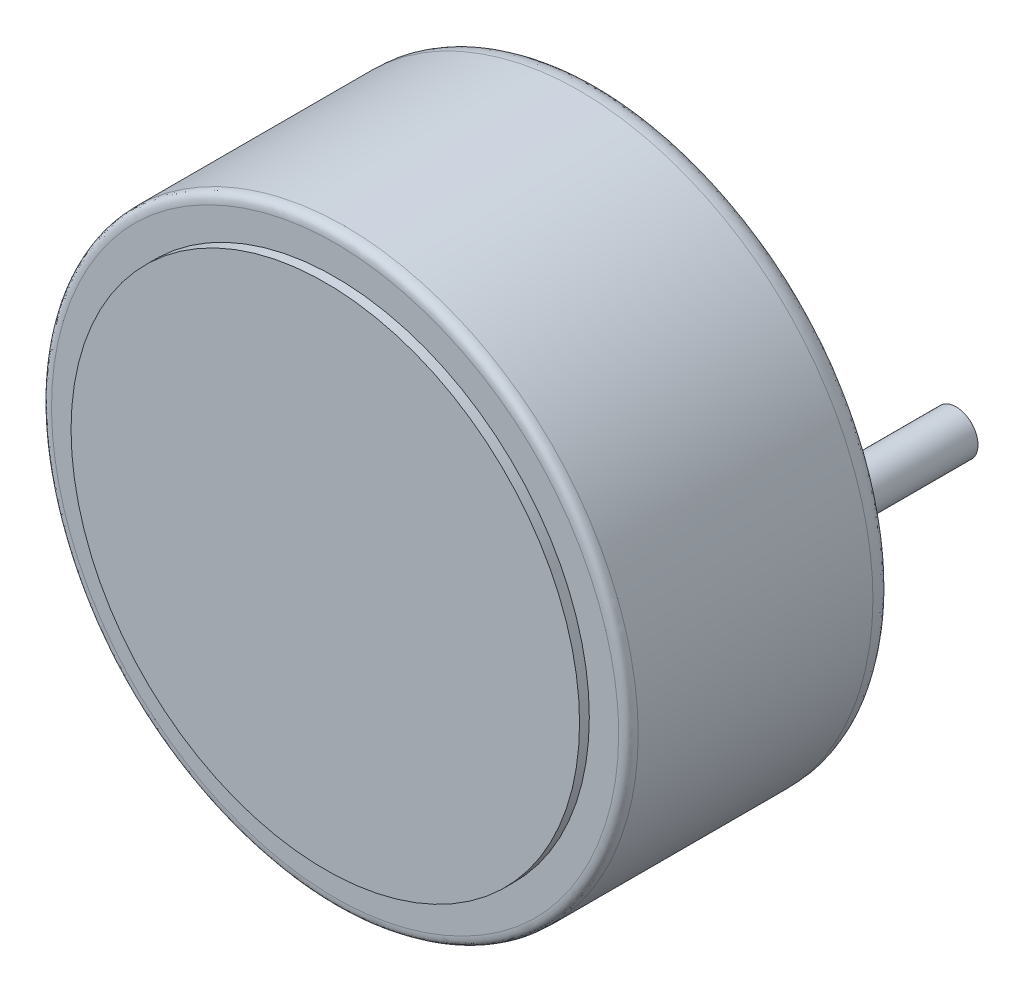
ISO-10303-21;
HEADER;
FILE_DESCRIPTION(('STEP AP214'),'2;1');
FILE_NAME('part.step','',(''),(''),'','','');
FILE_SCHEMA(('AUTOMOTIVE_DESIGN { 1 0 10303 214 1 1 1 1 }'));
ENDSEC;
DATA;
#1=APPLICATION_CONTEXT('core data for automotive mechanical design processes');
#2=APPLICATION_PROTOCOL_DEFINITION('international standard','automotive_design',2000,#1);
#3=PRODUCT_CONTEXT('',#1,'mechanical');
#4=PRODUCT('Part','Part','',(#3));
#5=PRODUCT_RELATED_PRODUCT_CATEGORY('part','',(#4));
#6=PRODUCT_DEFINITION_FORMATION('','',#4);
#7=PRODUCT_DEFINITION_CONTEXT('part definition',#1,'design');
#8=PRODUCT_DEFINITION('design','',#6,#7);
#9=PRODUCT_DEFINITION_SHAPE('','',#8);
#10=(LENGTH_UNIT() NAMED_UNIT(*) SI_UNIT(.MILLI.,.METRE.));
#11=(NAMED_UNIT(*) PLANE_ANGLE_UNIT() SI_UNIT($,.RADIAN.));
#12=(NAMED_UNIT(*) SI_UNIT($,.STERADIAN.) SOLID_ANGLE_UNIT());
#13=UNCERTAINTY_MEASURE_WITH_UNIT(LENGTH_MEASURE(1.E-05),#10,'distance_accuracy_value','');
#14=(GEOMETRIC_REPRESENTATION_CONTEXT(3) GLOBAL_UNCERTAINTY_ASSIGNED_CONTEXT((#13)) GLOBAL_UNIT_ASSIGNED_CONTEXT((#10,
#11,#12)) REPRESENTATION_CONTEXT('',''));
#15=CARTESIAN_POINT('',(0.,0.,0.));
#16=DIRECTION('',(0.,0.,1.));
#17=DIRECTION('',(1.,0.,0.));
#18=AXIS2_PLACEMENT_3D('',#15,#16,#17);
#19=CARTESIAN_POINT('',(0.,0.,2.7));
#20=DIRECTION('',(0.,0.,-1.));
#21=DIRECTION('',(-1.,0.,0.));
#22=AXIS2_PLACEMENT_3D('',#19,#20,#21);
#23=CYLINDRICAL_SURFACE('',#22,3.);
#24=CARTESIAN_POINT('',(3.,0.,0.2));
#25=CARTESIAN_POINT('',(3.,-0.783611624891226,0.2));
#26=CARTESIAN_POINT('',(2.35083487467366,-2.35083487467369,0.2));
#27=CARTESIAN_POINT('',(0.,-3.32458256266316,0.2));
#28=CARTESIAN_POINT('',(-2.35083487467367,-2.35083487467368,0.2));
#29=CARTESIAN_POINT('',(-3.32458256266316,0.,0.2));
#30=CARTESIAN_POINT('',(-2.35083487467368,2.35083487467367,0.2));
#31=CARTESIAN_POINT('',(0.,3.32458256266316,0.2));
#32=CARTESIAN_POINT('',(2.35083487467367,2.35083487467367,0.2));
#33=CARTESIAN_POINT('',(3.,0.783611624891226,0.2));
#34=CARTESIAN_POINT('',(3.,0.,0.2));
#35=B_SPLINE_CURVE_WITH_KNOTS('',3,(#24,#25,#26,#27,#28,#29,#30,#31,#32,#33,#34),.UNSPECIFIED.,
.T.,.F.,(4,1,1,1,1,1,1,1,4),(0.,0.785398163397448,1.5707963267949,2.35619449019235,
3.14159265358979,3.92699081698724,4.71238898038469,5.49778714378214,6.28318530717959),.UNSPECIFIED.);
#36=CARTESIAN_POINT('',(3.,0.,0.2));
#37=VERTEX_POINT('',#36);
#38=EDGE_CURVE('E57',#37,#37,#35,.F.);
#39=ORIENTED_EDGE('',*,*,#38,.T.);
#40=EDGE_LOOP('',(#39));
#41=FACE_BOUND('',#40,.T.);
#42=CARTESIAN_POINT('',(3.,0.,2.6));
#43=CARTESIAN_POINT('',(3.,0.783611624891226,2.6));
#44=CARTESIAN_POINT('',(2.35083487467367,2.35083487467367,2.6));
#45=CARTESIAN_POINT('',(0.,3.32458256266316,2.6));
#46=CARTESIAN_POINT('',(-2.35083487467368,2.35083487467367,2.6));
#47=CARTESIAN_POINT('',(-3.32458256266316,0.,2.6));
#48=CARTESIAN_POINT('',(-2.35083487467368,-2.35083487467368,2.6));
#49=CARTESIAN_POINT('',(0.,-3.32458256266316,2.6));
#50=CARTESIAN_POINT('',(2.35083487467366,-2.35083487467368,2.6));
#51=CARTESIAN_POINT('',(3.,-0.783611624891226,2.6));
#52=CARTESIAN_POINT('',(3.,0.,2.6));
#53=B_SPLINE_CURVE_WITH_KNOTS('',3,(#42,#43,#44,#45,#46,#47,#48,#49,#50,#51,#52),.UNSPECIFIED.,
.T.,.F.,(4,1,1,1,1,1,1,1,4),(0.,0.785398163397448,1.5707963267949,2.35619449019234,
3.14159265358979,3.92699081698724,4.71238898038469,5.49778714378214,6.28318530717959),.UNSPECIFIED.);
#54=CARTESIAN_POINT('',(3.,0.,2.6));
#55=VERTEX_POINT('',#54);
#56=EDGE_CURVE('E62',#55,#55,#53,.F.);
#57=ORIENTED_EDGE('',*,*,#56,.T.);
#58=EDGE_LOOP('',(#57));
#59=FACE_BOUND('',#58,.T.);
#60=ADVANCED_FACE('F38',(#41,#59),#23,.T.);
#61=CARTESIAN_POINT('',(0.,0.,2.7));
#62=DIRECTION('',(0.,0.,1.));
#63=DIRECTION('',(1.,0.,0.));
#64=AXIS2_PLACEMENT_3D('',#61,#62,#63);
#65=PLANE('',#64);
#66=CARTESIAN_POINT('',(0.,0.,2.7));
#67=DIRECTION('',(0.,0.,1.));
#68=DIRECTION('',(1.,0.,0.));
#69=AXIS2_PLACEMENT_3D('',#66,#67,#68);
#70=CIRCLE('',#69,2.6);
#71=CARTESIAN_POINT('',(2.6,0.,2.7));
#72=VERTEX_POINT('',#71);
#73=EDGE_CURVE('E77',#72,#72,#70,.T.);
#74=ORIENTED_EDGE('',*,*,#73,.F.);
#75=EDGE_LOOP('',(#74));
#76=FACE_BOUND('',#75,.T.);
#77=CARTESIAN_POINT('',(2.9,0.,2.7));
#78=CARTESIAN_POINT('',(2.9,-0.757491237394852,2.7));
#79=CARTESIAN_POINT('',(2.27247371218454,-2.27247371218456,2.7));
#80=CARTESIAN_POINT('',(0.,-3.21376314390772,2.7));
#81=CARTESIAN_POINT('',(-2.27247371218455,-2.27247371218455,2.7));
#82=CARTESIAN_POINT('',(-3.21376314390772,0.,2.7));
#83=CARTESIAN_POINT('',(-2.27247371218455,2.27247371218455,2.7));
#84=CARTESIAN_POINT('',(0.,3.21376314390773,2.7));
#85=CARTESIAN_POINT('',(2.27247371218455,2.27247371218455,2.7));
#86=CARTESIAN_POINT('',(2.9,0.757491237394852,2.7));
#87=CARTESIAN_POINT('',(2.9,0.,2.7));
#88=B_SPLINE_CURVE_WITH_KNOTS('',3,(#77,#78,#79,#80,#81,#82,#83,#84,#85,#86,#87),.UNSPECIFIED.,
.T.,.F.,(4,1,1,1,1,1,1,1,4),(0.,0.785398163397448,1.5707963267949,2.35619449019235,
3.14159265358979,3.92699081698724,4.71238898038469,5.49778714378214,6.28318530717959),.UNSPECIFIED.);
#89=CARTESIAN_POINT('',(2.9,0.,2.7));
#90=VERTEX_POINT('',#89);
#91=EDGE_CURVE('E67',#90,#90,#88,.F.);
#92=ORIENTED_EDGE('',*,*,#91,.T.);
#93=EDGE_LOOP('',(#92));
#94=FACE_BOUND('',#93,.T.);
#95=ADVANCED_FACE('F92',(#76,#94),#65,.T.);
#96=CARTESIAN_POINT('',(0.,0.,0.));
#97=DIRECTION('',(0.,0.,1.));
#98=DIRECTION('',(1.,0.,0.));
#99=AXIS2_PLACEMENT_3D('',#96,#97,#98);
#100=PLANE('',#99);
#101=CARTESIAN_POINT('',(2.8,0.,0.));
#102=CARTESIAN_POINT('',(2.8,0.731370849898478,0.));
#103=CARTESIAN_POINT('',(2.19411254969543,2.19411254969543,0.));
#104=CARTESIAN_POINT('',(0.,3.10294372515229,0.));
#105=CARTESIAN_POINT('',(-2.19411254969543,2.19411254969543,0.));
#106=CARTESIAN_POINT('',(-3.10294372515229,0.,0.));
#107=CARTESIAN_POINT('',(-2.19411254969543,-2.19411254969543,0.));
#108=CARTESIAN_POINT('',(0.,-3.10294372515228,0.));
#109=CARTESIAN_POINT('',(2.19411254969542,-2.19411254969544,0.));
#110=CARTESIAN_POINT('',(2.8,-0.731370849898478,0.));
#111=CARTESIAN_POINT('',(2.8,0.,0.));
#112=B_SPLINE_CURVE_WITH_KNOTS('',3,(#101,#102,#103,#104,#105,#106,#107,#108,#109,#110,#111),
.UNSPECIFIED.,.T.,.F.,(4,1,1,1,1,1,1,1,4),(0.,0.785398163397448,1.5707963267949,
2.35619449019234,3.14159265358979,3.92699081698724,4.71238898038469,5.49778714378214,
6.28318530717959),.UNSPECIFIED.);
#113=CARTESIAN_POINT('',(2.8,0.,0.));
#114=VERTEX_POINT('',#113);
#115=EDGE_CURVE('E11',#114,#114,#112,.F.);
#116=ORIENTED_EDGE('',*,*,#115,.T.);
#117=EDGE_LOOP('',(#116));
#118=FACE_BOUND('',#117,.T.);
#119=CARTESIAN_POINT('',(-2.6732050807569,0.,0.));
#120=CARTESIAN_POINT('',(-2.6732050807569,0.698251525666463,0.));
#121=CARTESIAN_POINT('',(-2.09475457699939,2.09475457699939,0.));
#122=CARTESIAN_POINT('',(0.,2.96243033263565,0.));
#123=CARTESIAN_POINT('',(2.09475457699939,2.09475457699939,0.));
#124=CARTESIAN_POINT('',(2.96243033263565,0.,0.));
#125=CARTESIAN_POINT('',(2.09475457699939,-2.09475457699939,0.));
#126=CARTESIAN_POINT('',(0.,-2.96243033263565,0.));
#127=CARTESIAN_POINT('',(-2.09475457699939,-2.09475457699939,0.));
#128=CARTESIAN_POINT('',(-2.6732050807569,-0.698251525666463,0.));
#129=CARTESIAN_POINT('',(-2.6732050807569,0.,0.));
#130=B_SPLINE_CURVE_WITH_KNOTS('',3,(#119,#120,#121,#122,#123,#124,#125,#126,#127,#128,#129),
.UNSPECIFIED.,.T.,.F.,(4,1,1,1,1,1,1,1,4),(-3.14159265358979,-2.35619449019234,-1.5707963267949,
-0.785398163397448,0.,0.785398163397448,1.5707963267949,2.35619449019234,3.14159265358979),.UNSPECIFIED.);
#131=CARTESIAN_POINT('',(-2.6732050807569,0.,0.));
#132=VERTEX_POINT('',#131);
#133=EDGE_CURVE('E52',#132,#132,#130,.F.);
#134=ORIENTED_EDGE('',*,*,#133,.T.);
#135=EDGE_LOOP('',(#134));
#136=FACE_BOUND('',#135,.T.);
#137=ADVANCED_FACE('F102',(#118,#136),#100,.F.);
#138=CARTESIAN_POINT('',(2.9,0.,2.7));
#139=CARTESIAN_POINT('',(2.9,0.757491237394852,2.7));
#140=CARTESIAN_POINT('',(2.27247371218455,2.27247371218455,2.7));
#141=CARTESIAN_POINT('',(0.,3.21376314390773,2.7));
#142=CARTESIAN_POINT('',(-2.27247371218455,2.27247371218455,2.7));
#143=CARTESIAN_POINT('',(-3.21376314390772,0.,2.7));
#144=CARTESIAN_POINT('',(-2.27247371218455,-2.27247371218455,2.7));
#145=CARTESIAN_POINT('',(0.,-3.21376314390772,2.7));
#146=CARTESIAN_POINT('',(2.27247371218454,-2.27247371218456,2.7));
#147=CARTESIAN_POINT('',(2.9,-0.757491237394852,2.7));
#148=CARTESIAN_POINT('',(2.9,0.,2.7));
#149=CARTESIAN_POINT('',(2.9168198051534,0.,2.7));
#150=CARTESIAN_POINT('',(2.9168198051534,0.761884635677054,2.7));
#151=CARTESIAN_POINT('',(2.28565390703116,2.28565390703116,2.7));
#152=CARTESIAN_POINT('',(0.,3.23240275421452,2.7));
#153=CARTESIAN_POINT('',(-2.28565390703116,2.28565390703115,2.7));
#154=CARTESIAN_POINT('',(-3.23240275421451,0.,2.7));
#155=CARTESIAN_POINT('',(-2.28565390703116,-2.28565390703116,2.7));
#156=CARTESIAN_POINT('',(0.,-3.23240275421451,2.7));
#157=CARTESIAN_POINT('',(2.28565390703114,-2.28565390703117,2.7));
#158=CARTESIAN_POINT('',(2.91681980515339,-0.761884635677054,2.7));
#159=CARTESIAN_POINT('',(2.9168198051534,0.,2.7));
#160=CARTESIAN_POINT('',(2.93363961030679,0.,2.7));
#161=CARTESIAN_POINT('',(2.93363961030679,0.766278033959256,2.7));
#162=CARTESIAN_POINT('',(2.29883410187776,2.29883410187776,2.7));
#163=CARTESIAN_POINT('',(0.,3.2510423645213,2.7));
#164=CARTESIAN_POINT('',(-2.29883410187777,2.29883410187776,2.7));
#165=CARTESIAN_POINT('',(-3.2510423645213,0.,2.7));
#166=CARTESIAN_POINT('',(-2.29883410187776,-2.29883410187777,2.7));
#167=CARTESIAN_POINT('',(0.,-3.2510423645213,2.7));
#168=CARTESIAN_POINT('',(2.29883410187775,-2.29883410187777,2.7));
#169=CARTESIAN_POINT('',(2.93363961030679,-0.766278033959256,2.7));
#170=CARTESIAN_POINT('',(2.93363961030679,0.,2.7));
#171=CARTESIAN_POINT('',(2.97071067811866,0.,2.69283080801639));
#172=CARTESIAN_POINT('',(2.97071067811866,0.775961140520759,2.69283080801639));
#173=CARTESIAN_POINT('',(2.32788342156227,2.32788342156227,2.69283080801639));
#174=CARTESIAN_POINT('',(0.,3.29212430639685,2.69283080801639));
#175=CARTESIAN_POINT('',(-2.32788342156227,2.32788342156227,2.69283080801639));
#176=CARTESIAN_POINT('',(-3.29212430639685,0.,2.69283080801639));
#177=CARTESIAN_POINT('',(-2.32788342156227,-2.32788342156227,2.69283080801639));
#178=CARTESIAN_POINT('',(0.,-3.29212430639684,2.69283080801639));
#179=CARTESIAN_POINT('',(2.32788342156226,-2.32788342156228,2.69283080801639));
#180=CARTESIAN_POINT('',(2.97071067811865,-0.775961140520759,2.69283080801639));
#181=CARTESIAN_POINT('',(2.97071067811866,0.,2.69283080801639));
#182=CARTESIAN_POINT('',(2.99283080801639,0.,2.67071067811865));
#183=CARTESIAN_POINT('',(2.99283080801639,0.781739004164749,2.67071067811865));
#184=CARTESIAN_POINT('',(2.34521701249424,2.34521701249424,2.67071067811866));
#185=CARTESIAN_POINT('',(0.,3.31663770577747,2.67071067811865));
#186=CARTESIAN_POINT('',(-2.34521701249424,2.34521701249424,2.67071067811865));
#187=CARTESIAN_POINT('',(-3.31663770577747,0.,2.67071067811865));
#188=CARTESIAN_POINT('',(-2.34521701249424,-2.34521701249424,2.67071067811866));
#189=CARTESIAN_POINT('',(0.,-3.31663770577746,2.67071067811865));
#190=CARTESIAN_POINT('',(2.34521701249423,-2.34521701249425,2.67071067811866));
#191=CARTESIAN_POINT('',(2.99283080801639,-0.781739004164749,2.67071067811865));
#192=CARTESIAN_POINT('',(2.99283080801639,0.,2.67071067811865));
#193=CARTESIAN_POINT('',(3.,0.,2.63363961030679));
#194=CARTESIAN_POINT('',(3.,0.783611624891226,2.63363961030679));
#195=CARTESIAN_POINT('',(2.35083487467367,2.35083487467367,2.63363961030679));
#196=CARTESIAN_POINT('',(0.,3.32458256266316,2.63363961030679));
#197=CARTESIAN_POINT('',(-2.35083487467368,2.35083487467367,2.63363961030679));
#198=CARTESIAN_POINT('',(-3.32458256266316,0.,2.63363961030679));
#199=CARTESIAN_POINT('',(-2.35083487467368,-2.35083487467368,2.63363961030679));
#200=CARTESIAN_POINT('',(0.,-3.32458256266316,2.63363961030679));
#201=CARTESIAN_POINT('',(2.35083487467366,-2.35083487467368,2.63363961030679));
#202=CARTESIAN_POINT('',(3.,-0.783611624891226,2.63363961030679));
#203=CARTESIAN_POINT('',(3.,0.,2.63363961030679));
#204=CARTESIAN_POINT('',(3.,0.,2.6168198051534));
#205=CARTESIAN_POINT('',(3.,0.783611624891226,2.6168198051534));
#206=CARTESIAN_POINT('',(2.35083487467367,2.35083487467367,2.6168198051534));
#207=CARTESIAN_POINT('',(0.,3.32458256266316,2.6168198051534));
#208=CARTESIAN_POINT('',(-2.35083487467368,2.35083487467367,2.61681980515339));
#209=CARTESIAN_POINT('',(-3.32458256266316,0.,2.6168198051534));
#210=CARTESIAN_POINT('',(-2.35083487467368,-2.35083487467368,2.6168198051534));
#211=CARTESIAN_POINT('',(0.,-3.32458256266316,2.61681980515339));
#212=CARTESIAN_POINT('',(2.35083487467366,-2.35083487467368,2.6168198051534));
#213=CARTESIAN_POINT('',(3.,-0.783611624891226,2.6168198051534));
#214=CARTESIAN_POINT('',(3.,0.,2.6168198051534));
#215=CARTESIAN_POINT('',(3.,0.,2.6));
#216=CARTESIAN_POINT('',(3.,0.783611624891226,2.6));
#217=CARTESIAN_POINT('',(2.35083487467367,2.35083487467367,2.6));
#218=CARTESIAN_POINT('',(0.,3.32458256266316,2.6));
#219=CARTESIAN_POINT('',(-2.35083487467368,2.35083487467367,2.6));
#220=CARTESIAN_POINT('',(-3.32458256266316,0.,2.6));
#221=CARTESIAN_POINT('',(-2.35083487467368,-2.35083487467368,2.6));
#222=CARTESIAN_POINT('',(0.,-3.32458256266316,2.6));
#223=CARTESIAN_POINT('',(2.35083487467366,-2.35083487467368,2.6));
#224=CARTESIAN_POINT('',(3.,-0.783611624891226,2.6));
#225=CARTESIAN_POINT('',(3.,0.,2.6));
#226=B_SPLINE_SURFACE_WITH_KNOTS('',5,3,((#138,#139,#140,#141,#142,#143,#144,#145,#146,#147,
#148),(#149,#150,#151,#152,#153,#154,#155,#156,#157,#158,#159),(#160,#161,#162,#163,#164,#165,
#166,#167,#168,#169,#170),(#171,#172,#173,#174,#175,#176,#177,#178,#179,#180,#181),(#182,#183,
#184,#185,#186,#187,#188,#189,#190,#191,#192),(#193,#194,#195,#196,#197,#198,#199,#200,#201,
#202,#203),(#204,#205,#206,#207,#208,#209,#210,#211,#212,#213,#214),(#215,#216,#217,#218,#219,
#220,#221,#222,#223,#224,#225)),.UNSPECIFIED.,.F.,.T.,.F.,(6,2,6),(4,1,1,1,1,1,1,1,4),(0.,0.5,
1.),(0.,0.785398163397448,1.5707963267949,2.35619449019234,3.14159265358979,3.92699081698724,
4.71238898038469,5.49778714378214,6.28318530717959),.UNSPECIFIED.);
#227=ORIENTED_EDGE('',*,*,#56,.F.);
#228=EDGE_LOOP('',(#227));
#229=FACE_BOUND('',#228,.T.);
#230=ORIENTED_EDGE('',*,*,#91,.F.);
#231=EDGE_LOOP('',(#230));
#232=FACE_BOUND('',#231,.T.);
#233=ADVANCED_FACE('F109',(#229,#232),#226,.T.);
#234=CARTESIAN_POINT('',(0.,0.,2.8));
#235=DIRECTION('',(0.,0.,-1.));
#236=DIRECTION('',(-1.,0.,0.));
#237=AXIS2_PLACEMENT_3D('',#234,#235,#236);
#238=CYLINDRICAL_SURFACE('',#237,2.6);
#239=CARTESIAN_POINT('',(0.,0.,2.8));
#240=DIRECTION('',(0.,0.,1.));
#241=DIRECTION('',(1.,0.,0.));
#242=AXIS2_PLACEMENT_3D('',#239,#240,#241);
#243=CIRCLE('',#242,2.6);
#244=CARTESIAN_POINT('',(2.6,0.,2.8));
#245=VERTEX_POINT('',#244);
#246=EDGE_CURVE('E72',#245,#245,#243,.T.);
#247=ORIENTED_EDGE('',*,*,#246,.F.);
#248=EDGE_LOOP('',(#247));
#249=FACE_BOUND('',#248,.T.);
#250=ORIENTED_EDGE('',*,*,#73,.T.);
#251=EDGE_LOOP('',(#250));
#252=FACE_BOUND('',#251,.T.);
#253=ADVANCED_FACE('F104',(#249,#252),#238,.T.);
#254=CARTESIAN_POINT('',(0.,0.,2.8));
#255=DIRECTION('',(0.,0.,1.));
#256=DIRECTION('',(1.,0.,0.));
#257=AXIS2_PLACEMENT_3D('',#254,#255,#256);
#258=PLANE('',#257);
#259=ORIENTED_EDGE('',*,*,#246,.T.);
#260=EDGE_LOOP('',(#259));
#261=FACE_BOUND('',#260,.T.);
#262=ADVANCED_FACE('F229',(#261),#258,.T.);
#263=CARTESIAN_POINT('',(0.,0.,0.1));
#264=DIRECTION('',(0.,0.,-1.));
#265=DIRECTION('',(-1.,0.,0.));
#266=AXIS2_PLACEMENT_3D('',#263,#264,#265);
#267=PLANE('',#266);
#268=CARTESIAN_POINT('',(-0.95,-1.,0.1));
#269=DIRECTION('',(0.,0.,-1.));
#270=DIRECTION('',(-1.,0.,0.));
#271=AXIS2_PLACEMENT_3D('',#268,#269,#270);
#272=CIRCLE('',#271,0.75);
#273=CARTESIAN_POINT('',(-1.7,-1.,0.1));
#274=VERTEX_POINT('',#273);
#275=EDGE_CURVE('E199',#274,#274,#272,.T.);
#276=ORIENTED_EDGE('',*,*,#275,.F.);
#277=EDGE_LOOP('',(#276));
#278=FACE_BOUND('',#277,.T.);
#279=CARTESIAN_POINT('',(0.95,-1.,0.1));
#280=DIRECTION('',(0.,0.,-1.));
#281=DIRECTION('',(-1.,0.,0.));
#282=AXIS2_PLACEMENT_3D('',#279,#280,#281);
#283=CIRCLE('',#282,0.225);
#284=CARTESIAN_POINT('',(0.725,-1.,0.1));
#285=VERTEX_POINT('',#284);
#286=EDGE_CURVE('E85',#285,#285,#283,.T.);
#287=ORIENTED_EDGE('',*,*,#286,.F.);
#288=EDGE_LOOP('',(#287));
#289=FACE_BOUND('',#288,.T.);
#290=CARTESIAN_POINT('',(-2.50000000000001,0.,0.100000000000004));
#291=CARTESIAN_POINT('',(-2.50000000000001,-0.653009687409355,0.100000000000004));
#292=CARTESIAN_POINT('',(-1.95902906222807,-1.95902906222807,0.100000000000004));
#293=CARTESIAN_POINT('',(0.,-2.77048546888598,0.100000000000004));
#294=CARTESIAN_POINT('',(1.95902906222807,-1.95902906222806,0.100000000000004));
#295=CARTESIAN_POINT('',(2.77048546888598,0.,0.100000000000004));
#296=CARTESIAN_POINT('',(1.95902906222807,1.95902906222807,0.100000000000005));
#297=CARTESIAN_POINT('',(0.,2.77048546888598,0.100000000000004));
#298=CARTESIAN_POINT('',(-1.95902906222807,1.95902906222806,0.100000000000004));
#299=CARTESIAN_POINT('',(-2.50000000000001,0.653009687409356,0.100000000000004));
#300=CARTESIAN_POINT('',(-2.50000000000001,0.,0.100000000000004));
#301=B_SPLINE_CURVE_WITH_KNOTS('',3,(#290,#291,#292,#293,#294,#295,#296,#297,#298,#299,#300),
.UNSPECIFIED.,.T.,.F.,(4,1,1,1,1,1,1,1,4),(-3.14159265358979,-2.35619449019234,-1.5707963267949,
-0.785398163397448,0.,0.785398163397448,1.5707963267949,2.35619449019234,3.14159265358979),.UNSPECIFIED.);
#302=CARTESIAN_POINT('',(-2.50000000000001,0.,0.100000000000004));
#303=VERTEX_POINT('',#302);
#304=EDGE_CURVE('E82',#303,#303,#301,.F.);
#305=ORIENTED_EDGE('',*,*,#304,.T.);
#306=EDGE_LOOP('',(#305));
#307=FACE_BOUND('',#306,.T.);
#308=ADVANCED_FACE('F145',(#278,#289,#307),#267,.T.);
#309=CARTESIAN_POINT('',(3.,0.,0.2));
#310=CARTESIAN_POINT('',(3.,0.783611624891226,0.2));
#311=CARTESIAN_POINT('',(2.35083487467367,2.35083487467367,0.2));
#312=CARTESIAN_POINT('',(0.,3.32458256266316,0.2));
#313=CARTESIAN_POINT('',(-2.35083487467368,2.35083487467367,0.2));
#314=CARTESIAN_POINT('',(-3.32458256266316,0.,0.2));
#315=CARTESIAN_POINT('',(-2.35083487467367,-2.35083487467368,0.2));
#316=CARTESIAN_POINT('',(0.,-3.32458256266316,0.2));
#317=CARTESIAN_POINT('',(2.35083487467366,-2.35083487467369,0.2));
#318=CARTESIAN_POINT('',(3.,-0.783611624891226,0.2));
#319=CARTESIAN_POINT('',(3.,0.,0.2));
#320=CARTESIAN_POINT('',(3.,0.,0.166360389693211));
#321=CARTESIAN_POINT('',(3.,0.783611624891226,0.166360389693211));
#322=CARTESIAN_POINT('',(2.35083487467367,2.35083487467367,0.166360389693211));
#323=CARTESIAN_POINT('',(0.,3.32458256266316,0.166360389693211));
#324=CARTESIAN_POINT('',(-2.35083487467368,2.35083487467367,0.166360389693211));
#325=CARTESIAN_POINT('',(-3.32458256266316,0.,0.166360389693211));
#326=CARTESIAN_POINT('',(-2.35083487467367,-2.35083487467368,0.166360389693211));
#327=CARTESIAN_POINT('',(0.,-3.32458256266316,0.166360389693211));
#328=CARTESIAN_POINT('',(2.35083487467366,-2.35083487467369,0.166360389693211));
#329=CARTESIAN_POINT('',(3.,-0.783611624891226,0.166360389693211));
#330=CARTESIAN_POINT('',(3.,0.,0.166360389693211));
#331=CARTESIAN_POINT('',(3.,0.,0.132720779386421));
#332=CARTESIAN_POINT('',(3.,0.783611624891226,0.132720779386421));
#333=CARTESIAN_POINT('',(2.35083487467367,2.35083487467367,0.132720779386422));
#334=CARTESIAN_POINT('',(0.,3.32458256266316,0.132720779386421));
#335=CARTESIAN_POINT('',(-2.35083487467368,2.35083487467367,0.132720779386422));
#336=CARTESIAN_POINT('',(-3.32458256266316,0.,0.132720779386421));
#337=CARTESIAN_POINT('',(-2.35083487467367,-2.35083487467368,0.132720779386422));
#338=CARTESIAN_POINT('',(0.,-3.32458256266316,0.132720779386421));
#339=CARTESIAN_POINT('',(2.35083487467366,-2.35083487467369,0.132720779386422));
#340=CARTESIAN_POINT('',(3.,-0.783611624891226,0.132720779386421));
#341=CARTESIAN_POINT('',(3.,0.,0.132720779386421));
#342=CARTESIAN_POINT('',(2.98566161603278,0.,0.0585786437626906));
#343=CARTESIAN_POINT('',(2.98566161603279,0.779866383438271,0.0585786437626906));
#344=CARTESIAN_POINT('',(2.33959915031481,2.33959915031481,0.0585786437626908));
#345=CARTESIAN_POINT('',(0.,3.30869284889177,0.0585786437626905));
#346=CARTESIAN_POINT('',(-2.33959915031481,2.3395991503148,0.0585786437626907));
#347=CARTESIAN_POINT('',(-3.30869284889177,0.,0.0585786437626905));
#348=CARTESIAN_POINT('',(-2.33959915031481,-2.33959915031481,0.0585786437626908));
#349=CARTESIAN_POINT('',(0.,-3.30869284889177,0.0585786437626901));
#350=CARTESIAN_POINT('',(2.3395991503148,-2.33959915031482,0.0585786437626907));
#351=CARTESIAN_POINT('',(2.98566161603278,-0.779866383438271,0.0585786437626906));
#352=CARTESIAN_POINT('',(2.98566161603278,0.,0.0585786437626906));
#353=CARTESIAN_POINT('',(2.94142135623731,0.,0.0143383839672168));
#354=CARTESIAN_POINT('',(2.94142135623731,0.768310656150291,0.0143383839672167));
#355=CARTESIAN_POINT('',(2.30493196845087,2.30493196845087,0.0143383839672165));
#356=CARTESIAN_POINT('',(0.,3.25966605013053,0.0143383839672169));
#357=CARTESIAN_POINT('',(-2.30493196845087,2.30493196845086,0.0143383839672165));
#358=CARTESIAN_POINT('',(-3.25966605013053,0.,0.0143383839672169));
#359=CARTESIAN_POINT('',(-2.30493196845087,-2.30493196845087,0.0143383839672163));
#360=CARTESIAN_POINT('',(0.,-3.25966605013053,0.0143383839672173));
#361=CARTESIAN_POINT('',(2.30493196845086,-2.30493196845088,0.0143383839672167));
#362=CARTESIAN_POINT('',(2.94142135623731,-0.768310656150291,0.0143383839672168));
#363=CARTESIAN_POINT('',(2.94142135623731,0.,0.0143383839672168));
#364=CARTESIAN_POINT('',(2.86727922061358,0.,0.));
#365=CARTESIAN_POINT('',(2.86727922061358,0.748944443027285,0.));
#366=CARTESIAN_POINT('',(2.24683332908185,2.24683332908185,0.));
#367=CARTESIAN_POINT('',(0.,3.17750216637944,0.));
#368=CARTESIAN_POINT('',(-2.24683332908185,2.24683332908185,0.));
#369=CARTESIAN_POINT('',(-3.17750216637944,0.,0.));
#370=CARTESIAN_POINT('',(-2.24683332908185,-2.24683332908185,0.));
#371=CARTESIAN_POINT('',(0.,-3.17750216637944,0.));
#372=CARTESIAN_POINT('',(2.24683332908184,-2.24683332908186,0.));
#373=CARTESIAN_POINT('',(2.86727922061358,-0.748944443027285,0.));
#374=CARTESIAN_POINT('',(2.86727922061358,0.,0.));
#375=CARTESIAN_POINT('',(2.83363961030679,0.,0.));
#376=CARTESIAN_POINT('',(2.83363961030679,0.740157646462881,0.));
#377=CARTESIAN_POINT('',(2.22047293938864,2.22047293938864,0.));
#378=CARTESIAN_POINT('',(0.,3.14022294576587,0.));
#379=CARTESIAN_POINT('',(-2.22047293938864,2.22047293938864,0.));
#380=CARTESIAN_POINT('',(-3.14022294576586,0.,0.));
#381=CARTESIAN_POINT('',(-2.22047293938864,-2.22047293938864,0.));
#382=CARTESIAN_POINT('',(0.,-3.14022294576586,0.));
#383=CARTESIAN_POINT('',(2.22047293938863,-2.22047293938865,0.));
#384=CARTESIAN_POINT('',(2.83363961030679,-0.740157646462882,0.));
#385=CARTESIAN_POINT('',(2.83363961030679,0.,0.));
#386=CARTESIAN_POINT('',(2.8,0.,0.));
#387=CARTESIAN_POINT('',(2.8,0.731370849898478,0.));
#388=CARTESIAN_POINT('',(2.19411254969543,2.19411254969543,0.));
#389=CARTESIAN_POINT('',(0.,3.10294372515229,0.));
#390=CARTESIAN_POINT('',(-2.19411254969543,2.19411254969543,0.));
#391=CARTESIAN_POINT('',(-3.10294372515229,0.,0.));
#392=CARTESIAN_POINT('',(-2.19411254969543,-2.19411254969543,0.));
#393=CARTESIAN_POINT('',(0.,-3.10294372515228,0.));
#394=CARTESIAN_POINT('',(2.19411254969542,-2.19411254969544,0.));
#395=CARTESIAN_POINT('',(2.8,-0.731370849898478,0.));
#396=CARTESIAN_POINT('',(2.8,0.,0.));
#397=B_SPLINE_SURFACE_WITH_KNOTS('',5,3,((#309,#310,#311,#312,#313,#314,#315,#316,#317,#318,
#319),(#320,#321,#322,#323,#324,#325,#326,#327,#328,#329,#330),(#331,#332,#333,#334,#335,#336,
#337,#338,#339,#340,#341),(#342,#343,#344,#345,#346,#347,#348,#349,#350,#351,#352),(#353,#354,
#355,#356,#357,#358,#359,#360,#361,#362,#363),(#364,#365,#366,#367,#368,#369,#370,#371,#372,
#373,#374),(#375,#376,#377,#378,#379,#380,#381,#382,#383,#384,#385),(#386,#387,#388,#389,#390,
#391,#392,#393,#394,#395,#396)),.UNSPECIFIED.,.F.,.T.,.F.,(6,2,6),(4,1,1,1,1,1,1,1,4),(0.,0.5,
1.),(0.,0.785398163397448,1.5707963267949,2.35619449019234,3.14159265358979,3.92699081698724,
4.71238898038469,5.49778714378214,6.28318530717959),.UNSPECIFIED.);
#398=ORIENTED_EDGE('',*,*,#115,.F.);
#399=EDGE_LOOP('',(#398));
#400=FACE_BOUND('',#399,.T.);
#401=ORIENTED_EDGE('',*,*,#38,.F.);
#402=EDGE_LOOP('',(#401));
#403=FACE_BOUND('',#402,.T.);
#404=ADVANCED_FACE('F132',(#400,#403),#397,.T.);
#405=CARTESIAN_POINT('',(-2.6732050807569,0.,0.));
#406=CARTESIAN_POINT('',(-2.6732050807569,-0.698251525666463,0.));
#407=CARTESIAN_POINT('',(-2.09475457699939,-2.09475457699939,0.));
#408=CARTESIAN_POINT('',(0.,-2.96243033263565,0.));
#409=CARTESIAN_POINT('',(2.09475457699939,-2.09475457699939,0.));
#410=CARTESIAN_POINT('',(2.96243033263565,0.,0.));
#411=CARTESIAN_POINT('',(2.09475457699939,2.09475457699939,0.));
#412=CARTESIAN_POINT('',(0.,2.96243033263565,0.));
#413=CARTESIAN_POINT('',(-2.09475457699939,2.09475457699939,0.));
#414=CARTESIAN_POINT('',(-2.6732050807569,0.698251525666463,0.));
#415=CARTESIAN_POINT('',(-2.6732050807569,0.,0.));
#416=CARTESIAN_POINT('',(-2.65248711305965,0.,0.));
#417=CARTESIAN_POINT('',(-2.65248711305965,-0.692839912222569,0.));
#418=CARTESIAN_POINT('',(-2.07851973666771,-2.07851973666771,0.));
#419=CARTESIAN_POINT('',(0.,-2.93947080125562,0.));
#420=CARTESIAN_POINT('',(2.07851973666771,-2.0785197366677,0.));
#421=CARTESIAN_POINT('',(2.93947080125562,0.,0.));
#422=CARTESIAN_POINT('',(2.07851973666771,2.07851973666771,0.));
#423=CARTESIAN_POINT('',(0.,2.93947080125563,0.));
#424=CARTESIAN_POINT('',(-2.07851973666771,2.0785197366677,0.));
#425=CARTESIAN_POINT('',(-2.65248711305965,0.692839912222569,0.));
#426=CARTESIAN_POINT('',(-2.65248711305965,0.,0.));
#427=CARTESIAN_POINT('',(-2.63176914536241,0.,0.));
#428=CARTESIAN_POINT('',(-2.63176914536241,-0.687428298778674,0.));
#429=CARTESIAN_POINT('',(-2.06228489633602,-2.06228489633603,0.));
#430=CARTESIAN_POINT('',(0.,-2.9165112698756,0.));
#431=CARTESIAN_POINT('',(2.06228489633603,-2.06228489633602,0.));
#432=CARTESIAN_POINT('',(2.9165112698756,0.,0.));
#433=CARTESIAN_POINT('',(2.06228489633602,2.06228489633602,0.));
#434=CARTESIAN_POINT('',(0.,2.9165112698756,0.));
#435=CARTESIAN_POINT('',(-2.06228489633603,2.06228489633602,0.));
#436=CARTESIAN_POINT('',(-2.63176914536241,0.687428298778675,0.));
#437=CARTESIAN_POINT('',(-2.63176914536241,0.,0.));
#438=CARTESIAN_POINT('',(-2.58554410049747,0.,0.00542311013684559));
#439=CARTESIAN_POINT('',(-2.58554410049747,-0.675354137939579,0.00542311013684557));
#440=CARTESIAN_POINT('',(-2.02606241381874,-2.02606241381874,0.0054231101368457));
#441=CARTESIAN_POINT('',(0.,-2.86528494383683,0.00542311013684558));
#442=CARTESIAN_POINT('',(2.02606241381874,-2.02606241381874,0.0054231101368457));
#443=CARTESIAN_POINT('',(2.86528494383683,0.,0.00542311013684549));
#444=CARTESIAN_POINT('',(2.02606241381874,2.02606241381874,0.00542311013684584));
#445=CARTESIAN_POINT('',(0.,2.86528494383683,0.00542311013684546));
#446=CARTESIAN_POINT('',(-2.02606241381874,2.02606241381874,0.00542311013684582));
#447=CARTESIAN_POINT('',(-2.58554410049747,0.67535413793958,0.00542311013684561));
#448=CARTESIAN_POINT('',(-2.58554410049747,0.,0.00542311013684559));
#449=CARTESIAN_POINT('',(-2.54852704127575,0.,0.0267949192431133));
#450=CARTESIAN_POINT('',(-2.54852704127575,-0.665685138631104,0.0267949192431133));
#451=CARTESIAN_POINT('',(-1.99705541589331,-1.99705541589332,0.0267949192431133));
#452=CARTESIAN_POINT('',(0.,-2.82426285396697,0.0267949192431137));
#453=CARTESIAN_POINT('',(1.99705541589332,-1.99705541589331,0.0267949192431133));
#454=CARTESIAN_POINT('',(2.82426285396697,0.,0.0267949192431133));
#455=CARTESIAN_POINT('',(1.99705541589331,1.99705541589331,0.0267949192431136));
#456=CARTESIAN_POINT('',(0.,2.82426285396697,0.0267949192431133));
#457=CARTESIAN_POINT('',(-1.99705541589332,1.99705541589331,0.0267949192431134));
#458=CARTESIAN_POINT('',(-2.54852704127575,0.665685138631105,0.0267949192431134));
#459=CARTESIAN_POINT('',(-2.54852704127575,0.,0.0267949192431133));
#460=CARTESIAN_POINT('',(-2.52071796769725,0.,0.0641154273188039));
#461=CARTESIAN_POINT('',(-2.52071796769725,-0.658421300853249,0.0641154273188039));
#462=CARTESIAN_POINT('',(-1.97526390255975,-1.97526390255975,0.0641154273188036));
#463=CARTESIAN_POINT('',(0.,-2.793445000266,0.0641154273188036));
#464=CARTESIAN_POINT('',(1.97526390255975,-1.97526390255975,0.0641154273188037));
#465=CARTESIAN_POINT('',(2.793445000266,0.,0.0641154273188039));
#466=CARTESIAN_POINT('',(1.97526390255975,1.97526390255975,0.0641154273188038));
#467=CARTESIAN_POINT('',(0.,2.793445000266,0.0641154273188039));
#468=CARTESIAN_POINT('',(-1.97526390255975,1.97526390255975,0.0641154273188037));
#469=CARTESIAN_POINT('',(-2.52071796769725,0.65842130085325,0.0641154273188039));
#470=CARTESIAN_POINT('',(-2.52071796769725,0.,0.0641154273188039));
#471=CARTESIAN_POINT('',(-2.51035898384863,0.,0.082057713659404));
#472=CARTESIAN_POINT('',(-2.51035898384863,-0.655715494131302,0.082057713659404));
#473=CARTESIAN_POINT('',(-1.96714648239391,-1.96714648239391,0.0820577136594039));
#474=CARTESIAN_POINT('',(0.,-2.78196523457599,0.0820577136594039));
#475=CARTESIAN_POINT('',(1.96714648239391,-1.96714648239391,0.0820577136594039));
#476=CARTESIAN_POINT('',(2.78196523457599,0.,0.082057713659404));
#477=CARTESIAN_POINT('',(1.96714648239391,1.96714648239391,0.0820577136594042));
#478=CARTESIAN_POINT('',(0.,2.78196523457599,0.082057713659404));
#479=CARTESIAN_POINT('',(-1.96714648239391,1.96714648239391,0.082057713659404));
#480=CARTESIAN_POINT('',(-2.51035898384863,0.655715494131303,0.082057713659404));
#481=CARTESIAN_POINT('',(-2.51035898384863,0.,0.082057713659404));
#482=CARTESIAN_POINT('',(-2.50000000000001,0.,0.100000000000004));
#483=CARTESIAN_POINT('',(-2.50000000000001,-0.653009687409355,0.100000000000004));
#484=CARTESIAN_POINT('',(-1.95902906222807,-1.95902906222807,0.100000000000004));
#485=CARTESIAN_POINT('',(0.,-2.77048546888598,0.100000000000004));
#486=CARTESIAN_POINT('',(1.95902906222807,-1.95902906222806,0.100000000000004));
#487=CARTESIAN_POINT('',(2.77048546888598,0.,0.100000000000004));
#488=CARTESIAN_POINT('',(1.95902906222807,1.95902906222807,0.100000000000005));
#489=CARTESIAN_POINT('',(0.,2.77048546888598,0.100000000000004));
#490=CARTESIAN_POINT('',(-1.95902906222807,1.95902906222806,0.100000000000004));
#491=CARTESIAN_POINT('',(-2.50000000000001,0.653009687409356,0.100000000000004));
#492=CARTESIAN_POINT('',(-2.50000000000001,0.,0.100000000000004));
#493=B_SPLINE_SURFACE_WITH_KNOTS('',5,3,((#405,#406,#407,#408,#409,#410,#411,#412,#413,#414,
#415),(#416,#417,#418,#419,#420,#421,#422,#423,#424,#425,#426),(#427,#428,#429,#430,#431,#432,
#433,#434,#435,#436,#437),(#438,#439,#440,#441,#442,#443,#444,#445,#446,#447,#448),(#449,#450,
#451,#452,#453,#454,#455,#456,#457,#458,#459),(#460,#461,#462,#463,#464,#465,#466,#467,#468,
#469,#470),(#471,#472,#473,#474,#475,#476,#477,#478,#479,#480,#481),(#482,#483,#484,#485,#486,
#487,#488,#489,#490,#491,#492)),.UNSPECIFIED.,.F.,.T.,.F.,(6,2,6),(4,1,1,1,1,1,1,1,4),(0.,0.5,
1.),(-3.14159265358979,-2.35619449019234,-1.5707963267949,-0.785398163397448,0.,
0.785398163397448,1.5707963267949,2.35619449019234,3.14159265358979),.UNSPECIFIED.);
#494=ORIENTED_EDGE('',*,*,#133,.F.);
#495=EDGE_LOOP('',(#494));
#496=FACE_BOUND('',#495,.T.);
#497=ORIENTED_EDGE('',*,*,#304,.F.);
#498=EDGE_LOOP('',(#497));
#499=FACE_BOUND('',#498,.T.);
#500=ADVANCED_FACE('F41',(#496,#499),#493,.T.);
#501=CARTESIAN_POINT('',(0.95,-1.,-2.7));
#502=DIRECTION('',(0.,0.,1.));
#503=DIRECTION('',(1.,0.,0.));
#504=AXIS2_PLACEMENT_3D('',#501,#502,#503);
#505=CYLINDRICAL_SURFACE('',#504,0.225);
#506=CARTESIAN_POINT('',(0.95,-1.,-2.7));
#507=DIRECTION('',(0.,0.,-1.));
#508=DIRECTION('',(-1.,0.,0.));
#509=AXIS2_PLACEMENT_3D('',#506,#507,#508);
#510=CIRCLE('',#509,0.225);
#511=CARTESIAN_POINT('',(0.725,-1.,-2.7));
#512=VERTEX_POINT('',#511);
#513=EDGE_CURVE('E186',#512,#512,#510,.T.);
#514=ORIENTED_EDGE('',*,*,#513,.F.);
#515=EDGE_LOOP('',(#514));
#516=FACE_BOUND('',#515,.T.);
#517=ORIENTED_EDGE('',*,*,#286,.T.);
#518=EDGE_LOOP('',(#517));
#519=FACE_BOUND('',#518,.T.);
#520=ADVANCED_FACE('F233',(#516,#519),#505,.T.);
#521=CARTESIAN_POINT('',(0.95,-1.,-2.7));
#522=DIRECTION('',(0.,0.,-1.));
#523=DIRECTION('',(-1.,0.,0.));
#524=AXIS2_PLACEMENT_3D('',#521,#522,#523);
#525=PLANE('',#524);
#526=ORIENTED_EDGE('',*,*,#513,.T.);
#527=EDGE_LOOP('',(#526));
#528=FACE_BOUND('',#527,.T.);
#529=ADVANCED_FACE('F223',(#528),#525,.T.);
#530=CARTESIAN_POINT('',(-0.95,-1.,0.11));
#531=DIRECTION('',(0.,0.,-1.));
#532=DIRECTION('',(-1.,0.,0.));
#533=AXIS2_PLACEMENT_3D('',#530,#531,#532);
#534=CYLINDRICAL_SURFACE('',#533,0.75);
#535=CARTESIAN_POINT('',(-0.95,-1.,0.11));
#536=DIRECTION('',(0.,0.,-1.));
#537=DIRECTION('',(-1.,0.,0.));
#538=AXIS2_PLACEMENT_3D('',#535,#536,#537);
#539=CIRCLE('',#538,0.75);
#540=CARTESIAN_POINT('',(-1.7,-1.,0.11));
#541=VERTEX_POINT('',#540);
#542=EDGE_CURVE('E196',#541,#541,#539,.T.);
#543=CARTESIAN_POINT('',(-1.7,-1.,0.11));
#544=CARTESIAN_POINT('',(-1.7,-1.,0.109895833333333));
#545=CARTESIAN_POINT('',(-1.7,-1.,0.109791666666667));
#546=CARTESIAN_POINT('',(-1.7,-1.,0.109583333333333));
#547=CARTESIAN_POINT('',(-1.7,-1.,0.109479166666667));
#548=CARTESIAN_POINT('',(-1.7,-1.,0.109270833333333));
#549=CARTESIAN_POINT('',(-1.7,-1.,0.109166666666667));
#550=CARTESIAN_POINT('',(-1.7,-1.,0.108958333333333));
#551=CARTESIAN_POINT('',(-1.7,-1.,0.108854166666667));
#552=CARTESIAN_POINT('',(-1.7,-1.,0.108645833333333));
#553=CARTESIAN_POINT('',(-1.7,-1.,0.108541666666667));
#554=CARTESIAN_POINT('',(-1.7,-1.,0.108333333333333));
#555=CARTESIAN_POINT('',(-1.7,-1.,0.108229166666667));
#556=CARTESIAN_POINT('',(-1.7,-1.,0.108020833333333));
#557=CARTESIAN_POINT('',(-1.7,-1.,0.107916666666667));
#558=CARTESIAN_POINT('',(-1.7,-1.,0.107708333333333));
#559=CARTESIAN_POINT('',(-1.7,-1.,0.107604166666667));
#560=CARTESIAN_POINT('',(-1.7,-1.,0.107395833333333));
#561=CARTESIAN_POINT('',(-1.7,-1.,0.107291666666667));
#562=CARTESIAN_POINT('',(-1.7,-1.,0.107083333333333));
#563=CARTESIAN_POINT('',(-1.7,-1.,0.106979166666667));
#564=CARTESIAN_POINT('',(-1.7,-1.,0.106770833333333));
#565=CARTESIAN_POINT('',(-1.7,-1.,0.106666666666667));
#566=CARTESIAN_POINT('',(-1.7,-1.,0.106458333333333));
#567=CARTESIAN_POINT('',(-1.7,-1.,0.106354166666667));
#568=CARTESIAN_POINT('',(-1.7,-1.,0.106145833333333));
#569=CARTESIAN_POINT('',(-1.7,-1.,0.106041666666667));
#570=CARTESIAN_POINT('',(-1.7,-1.,0.105833333333333));
#571=CARTESIAN_POINT('',(-1.7,-1.,0.105729166666667));
#572=CARTESIAN_POINT('',(-1.7,-1.,0.105520833333333));
#573=CARTESIAN_POINT('',(-1.7,-1.,0.105416666666667));
#574=CARTESIAN_POINT('',(-1.7,-1.,0.105208333333333));
#575=CARTESIAN_POINT('',(-1.7,-1.,0.105104166666667));
#576=CARTESIAN_POINT('',(-1.7,-1.,0.104895833333333));
#577=CARTESIAN_POINT('',(-1.7,-1.,0.104791666666667));
#578=CARTESIAN_POINT('',(-1.7,-1.,0.104583333333333));
#579=CARTESIAN_POINT('',(-1.7,-1.,0.104479166666667));
#580=CARTESIAN_POINT('',(-1.7,-1.,0.104270833333333));
#581=CARTESIAN_POINT('',(-1.7,-1.,0.104166666666667));
#582=CARTESIAN_POINT('',(-1.7,-1.,0.103958333333333));
#583=CARTESIAN_POINT('',(-1.7,-1.,0.103854166666667));
#584=CARTESIAN_POINT('',(-1.7,-1.,0.103645833333333));
#585=CARTESIAN_POINT('',(-1.7,-1.,0.103541666666667));
#586=CARTESIAN_POINT('',(-1.7,-1.,0.103333333333333));
#587=CARTESIAN_POINT('',(-1.7,-1.,0.103229166666667));
#588=CARTESIAN_POINT('',(-1.7,-1.,0.103020833333333));
#589=CARTESIAN_POINT('',(-1.7,-1.,0.102916666666667));
#590=CARTESIAN_POINT('',(-1.7,-1.,0.102708333333333));
#591=CARTESIAN_POINT('',(-1.7,-1.,0.102604166666667));
#592=CARTESIAN_POINT('',(-1.7,-1.,0.102395833333333));
#593=CARTESIAN_POINT('',(-1.7,-1.,0.102291666666667));
#594=CARTESIAN_POINT('',(-1.7,-1.,0.102083333333333));
#595=CARTESIAN_POINT('',(-1.7,-1.,0.101979166666667));
#596=CARTESIAN_POINT('',(-1.7,-1.,0.101770833333333));
#597=CARTESIAN_POINT('',(-1.7,-1.,0.101666666666667));
#598=CARTESIAN_POINT('',(-1.7,-1.,0.101458333333333));
#599=CARTESIAN_POINT('',(-1.7,-1.,0.101354166666667));
#600=CARTESIAN_POINT('',(-1.7,-1.,0.101145833333333));
#601=CARTESIAN_POINT('',(-1.7,-1.,0.101041666666667));
#602=CARTESIAN_POINT('',(-1.7,-1.,0.100833333333333));
#603=CARTESIAN_POINT('',(-1.7,-1.,0.100729166666667));
#604=CARTESIAN_POINT('',(-1.7,-1.,0.100520833333333));
#605=CARTESIAN_POINT('',(-1.7,-1.,0.100416666666667));
#606=CARTESIAN_POINT('',(-1.7,-1.,0.100208333333333));
#607=CARTESIAN_POINT('',(-1.7,-1.,0.100104166666667));
#608=CARTESIAN_POINT('',(-1.7,-1.,0.1));
#609=B_SPLINE_CURVE_WITH_KNOTS('',3,(#543,#544,#545,#546,#547,#548,#549,#550,#551,#552,#553,
#554,#555,#556,#557,#558,#559,#560,#561,#562,#563,#564,#565,#566,#567,#568,#569,#570,#571,#572,
#573,#574,#575,#576,#577,#578,#579,#580,#581,#582,#583,#584,#585,#586,#587,#588,#589,#590,#591,
#592,#593,#594,#595,#596,#597,#598,#599,#600,#601,#602,#603,#604,#605,#606,#607,#608),
.UNSPECIFIED.,.F.,.F.,(4,2,2,2,2,2,2,2,2,2,2,2,2,2,2,2,2,2,2,2,2,2,2,2,2,2,2,2,2,2,2,2,4),(0.,
0.000312499999999987,0.000624999999999988,0.000937499999999989,0.00124999999999999,
0.00156249999999999,0.00187499999999999,0.00218749999999999,0.00249999999999999,
0.00281249999999999,0.00312499999999999,0.0034375,0.00375,0.0040625,0.004375,0.0046875,0.005,
0.00531249999999999,0.00562499999999999,0.00593749999999999,0.00624999999999999,
0.00656249999999999,0.00687499999999999,0.00718749999999999,0.00749999999999999,
0.00781249999999999,0.00812499999999999,0.0084375,0.00875,0.0090625,0.009375,0.0096875,0.01),.UNSPECIFIED.);
#610=EDGE_CURVE('BSEAM217',#541,#274,#609,.T.);
#611=ORIENTED_EDGE('',*,*,#542,.F.);
#612=ORIENTED_EDGE('',*,*,#275,.T.);
#613=ORIENTED_EDGE('',*,*,#610,.T.);
#614=ORIENTED_EDGE('',*,*,#610,.F.);
#615=EDGE_LOOP('',(#611,#613,#612,#614));
#616=FACE_BOUND('',#615,.T.);
#617=ADVANCED_FACE('F217',(#616),#534,.F.);
#618=CARTESIAN_POINT('',(-0.95,-1.,0.11));
#619=DIRECTION('',(0.,0.,-1.));
#620=DIRECTION('',(-1.,0.,0.));
#621=AXIS2_PLACEMENT_3D('',#618,#619,#620);
#622=PLANE('',#621);
#623=CARTESIAN_POINT('',(-0.95,-1.,0.11));
#624=DIRECTION('',(0.,0.,-1.));
#625=DIRECTION('',(-1.,0.,0.));
#626=AXIS2_PLACEMENT_3D('',#623,#624,#625);
#627=CIRCLE('',#626,0.6);
#628=CARTESIAN_POINT('',(-1.55,-1.,0.11));
#629=VERTEX_POINT('',#628);
#630=EDGE_CURVE('E202',#629,#629,#627,.T.);
#631=ORIENTED_EDGE('',*,*,#630,.F.);
#632=EDGE_LOOP('',(#631));
#633=FACE_BOUND('',#632,.T.);
#634=ORIENTED_EDGE('',*,*,#542,.T.);
#635=EDGE_LOOP('',(#634));
#636=FACE_BOUND('',#635,.T.);
#637=ADVANCED_FACE('F214',(#633,#636),#622,.T.);
#638=CARTESIAN_POINT('',(-0.95,-1.,0.11));
#639=DIRECTION('',(0.,0.,-1.));
#640=DIRECTION('',(-1.,0.,0.));
#641=AXIS2_PLACEMENT_3D('',#638,#639,#640);
#642=CYLINDRICAL_SURFACE('',#641,0.6);
#643=ORIENTED_EDGE('',*,*,#630,.T.);
#644=EDGE_LOOP('',(#643));
#645=FACE_BOUND('',#644,.T.);
#646=CARTESIAN_POINT('',(-0.95,-1.,0.1));
#647=DIRECTION('',(0.,0.,-1.));
#648=DIRECTION('',(-1.,0.,0.));
#649=AXIS2_PLACEMENT_3D('',#646,#647,#648);
#650=CIRCLE('',#649,0.6);
#651=CARTESIAN_POINT('',(-1.55,-1.,0.1));
#652=VERTEX_POINT('',#651);
#653=EDGE_CURVE('E205',#652,#652,#650,.T.);
#654=ORIENTED_EDGE('',*,*,#653,.F.);
#655=EDGE_LOOP('',(#654));
#656=FACE_BOUND('',#655,.T.);
#657=ADVANCED_FACE('F211',(#645,#656),#642,.T.);
#658=CARTESIAN_POINT('',(-0.95,-1.,-2.7));
#659=DIRECTION('',(0.,0.,-1.));
#660=DIRECTION('',(-1.,0.,0.));
#661=AXIS2_PLACEMENT_3D('',#658,#659,#660);
#662=PLANE('',#661);
#663=CARTESIAN_POINT('',(-0.95,-1.,-2.7));
#664=DIRECTION('',(0.,0.,-1.));
#665=DIRECTION('',(-1.,0.,0.));
#666=AXIS2_PLACEMENT_3D('',#663,#664,#665);
#667=CIRCLE('',#666,0.225);
#668=CARTESIAN_POINT('',(-1.175,-1.,-2.7));
#669=VERTEX_POINT('',#668);
#670=EDGE_CURVE('E191',#669,#669,#667,.T.);
#671=ORIENTED_EDGE('',*,*,#670,.T.);
#672=EDGE_LOOP('',(#671));
#673=FACE_BOUND('',#672,.T.);
#674=ADVANCED_FACE('F303',(#673),#662,.T.);
#675=CARTESIAN_POINT('',(-0.95,-1.,-2.7));
#676=DIRECTION('',(0.,0.,1.));
#677=DIRECTION('',(1.,0.,0.));
#678=AXIS2_PLACEMENT_3D('',#675,#676,#677);
#679=CYLINDRICAL_SURFACE('',#678,0.225);
#680=ORIENTED_EDGE('',*,*,#670,.F.);
#681=EDGE_LOOP('',(#680));
#682=FACE_BOUND('',#681,.T.);
#683=CARTESIAN_POINT('',(-0.95,-1.,0.1));
#684=DIRECTION('',(0.,0.,-1.));
#685=DIRECTION('',(-1.,0.,0.));
#686=AXIS2_PLACEMENT_3D('',#683,#684,#685);
#687=CIRCLE('',#686,0.225);
#688=CARTESIAN_POINT('',(-1.175,-1.,0.1));
#689=VERTEX_POINT('',#688);
#690=EDGE_CURVE('E193',#689,#689,#687,.T.);
#691=ORIENTED_EDGE('',*,*,#690,.T.);
#692=EDGE_LOOP('',(#691));
#693=FACE_BOUND('',#692,.T.);
#694=ADVANCED_FACE('F300',(#682,#693),#679,.T.);
#695=ORIENTED_EDGE('',*,*,#690,.F.);
#696=EDGE_LOOP('',(#695));
#697=FACE_BOUND('',#696,.T.);
#698=ORIENTED_EDGE('',*,*,#653,.T.);
#699=EDGE_LOOP('',(#698));
#700=FACE_BOUND('',#699,.T.);
#701=ADVANCED_FACE('F230',(#697,#700),#267,.T.);
#702=CLOSED_SHELL('',(#60,#95,#137,#233,#253,#262,#308,#404,#500,#520,#529,#617,#637,#657,#674,
#694,#701));
#703=MANIFOLD_SOLID_BREP('B2',#702);
#704=ADVANCED_BREP_SHAPE_REPRESENTATION('',(#18,#703),#14);
#705=SHAPE_DEFINITION_REPRESENTATION(#9,#704);
ENDSEC;
END-ISO-10303-21;
